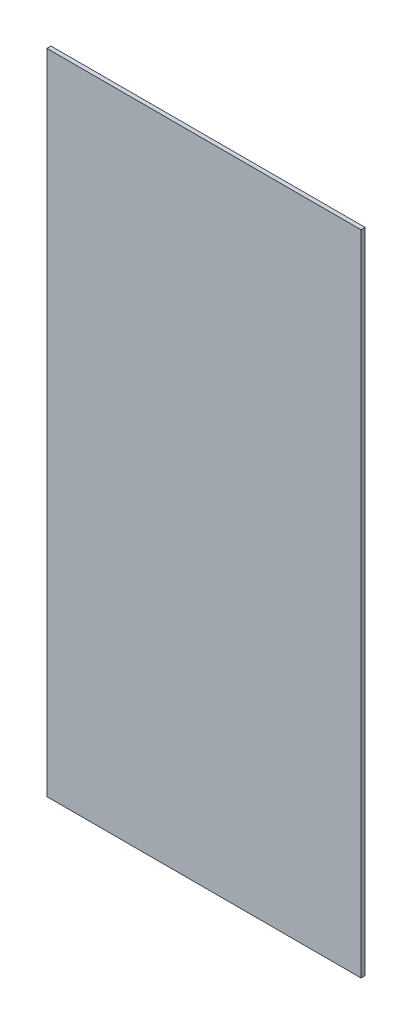
ISO-10303-21;
HEADER;
FILE_DESCRIPTION(('STEP AP214'),'2;1');
FILE_NAME('part.step','',(''),(''),'','','');
FILE_SCHEMA(('AUTOMOTIVE_DESIGN { 1 0 10303 214 1 1 1 1 }'));
ENDSEC;
DATA;
#1=APPLICATION_CONTEXT('core data for automotive mechanical design processes');
#2=APPLICATION_PROTOCOL_DEFINITION('international standard','automotive_design',2000,#1);
#3=PRODUCT_CONTEXT('',#1,'mechanical');
#4=PRODUCT('Part','Part','',(#3));
#5=PRODUCT_RELATED_PRODUCT_CATEGORY('part','',(#4));
#6=PRODUCT_DEFINITION_FORMATION('','',#4);
#7=PRODUCT_DEFINITION_CONTEXT('part definition',#1,'design');
#8=PRODUCT_DEFINITION('design','',#6,#7);
#9=PRODUCT_DEFINITION_SHAPE('','',#8);
#10=(LENGTH_UNIT() NAMED_UNIT(*) SI_UNIT(.MILLI.,.METRE.));
#11=(NAMED_UNIT(*) PLANE_ANGLE_UNIT() SI_UNIT($,.RADIAN.));
#12=(NAMED_UNIT(*) SI_UNIT($,.STERADIAN.) SOLID_ANGLE_UNIT());
#13=UNCERTAINTY_MEASURE_WITH_UNIT(LENGTH_MEASURE(1.E-05),#10,'distance_accuracy_value','');
#14=(GEOMETRIC_REPRESENTATION_CONTEXT(3) GLOBAL_UNCERTAINTY_ASSIGNED_CONTEXT((#13)) GLOBAL_UNIT_ASSIGNED_CONTEXT((#10,
#11,#12)) REPRESENTATION_CONTEXT('',''));
#15=CARTESIAN_POINT('',(0.,0.,0.));
#16=DIRECTION('',(0.,0.,1.));
#17=DIRECTION('',(1.,0.,0.));
#18=AXIS2_PLACEMENT_3D('',#15,#16,#17);
#19=CARTESIAN_POINT('',(0.,0.,15.875));
#20=DIRECTION('',(1.,0.,0.));
#21=DIRECTION('',(0.,0.,-1.));
#22=AXIS2_PLACEMENT_3D('',#19,#20,#21);
#23=PLANE('',#22);
#24=DIRECTION('',(0.,-1.,0.));
#25=VECTOR('',#24,1.);
#26=CARTESIAN_POINT('',(0.,0.,0.));
#27=LINE('',#26,#25);
#28=CARTESIAN_POINT('',(0.,2514.6,0.));
#29=VERTEX_POINT('',#28);
#30=CARTESIAN_POINT('',(0.,0.,0.));
#31=VERTEX_POINT('',#30);
#32=EDGE_CURVE('E95',#29,#31,#27,.T.);
#33=ORIENTED_EDGE('',*,*,#32,.T.);
#34=DIRECTION('',(0.,0.,-1.));
#35=VECTOR('',#34,1.);
#36=CARTESIAN_POINT('',(0.,0.,15.875));
#37=LINE('',#36,#35);
#38=CARTESIAN_POINT('',(0.,0.,15.875));
#39=VERTEX_POINT('',#38);
#40=EDGE_CURVE('E11',#39,#31,#37,.T.);
#41=ORIENTED_EDGE('',*,*,#40,.F.);
#42=DIRECTION('',(0.,-1.,0.));
#43=VECTOR('',#42,1.);
#44=CARTESIAN_POINT('',(0.,0.,15.875));
#45=LINE('',#44,#43);
#46=CARTESIAN_POINT('',(0.,2514.6,15.875));
#47=VERTEX_POINT('',#46);
#48=EDGE_CURVE('E83',#47,#39,#45,.T.);
#49=ORIENTED_EDGE('',*,*,#48,.F.);
#50=DIRECTION('',(0.,0.,-1.));
#51=VECTOR('',#50,1.);
#52=CARTESIAN_POINT('',(0.,2514.6,15.875));
#53=LINE('',#52,#51);
#54=EDGE_CURVE('E91',#47,#29,#53,.T.);
#55=ORIENTED_EDGE('',*,*,#54,.T.);
#56=EDGE_LOOP('',(#33,#41,#49,#55));
#57=FACE_BOUND('',#56,.T.);
#58=ADVANCED_FACE('F32',(#57),#23,.F.);
#59=CARTESIAN_POINT('',(0.,0.,15.875));
#60=DIRECTION('',(0.,1.,0.));
#61=DIRECTION('',(0.,0.,1.));
#62=AXIS2_PLACEMENT_3D('',#59,#60,#61);
#63=PLANE('',#62);
#64=DIRECTION('',(1.,0.,0.));
#65=VECTOR('',#64,1.);
#66=CARTESIAN_POINT('',(0.,0.,0.));
#67=LINE('',#66,#65);
#68=CARTESIAN_POINT('',(1219.2,0.,0.));
#69=VERTEX_POINT('',#68);
#70=EDGE_CURVE('E87',#31,#69,#67,.T.);
#71=ORIENTED_EDGE('',*,*,#70,.T.);
#72=DIRECTION('',(0.,0.,-1.));
#73=VECTOR('',#72,1.);
#74=CARTESIAN_POINT('',(1219.2,0.,15.875));
#75=LINE('',#74,#73);
#76=CARTESIAN_POINT('',(1219.2,0.,15.875));
#77=VERTEX_POINT('',#76);
#78=EDGE_CURVE('E40',#77,#69,#75,.T.);
#79=ORIENTED_EDGE('',*,*,#78,.F.);
#80=DIRECTION('',(1.,0.,0.));
#81=VECTOR('',#80,1.);
#82=CARTESIAN_POINT('',(0.,0.,15.875));
#83=LINE('',#82,#81);
#84=EDGE_CURVE('E78',#39,#77,#83,.T.);
#85=ORIENTED_EDGE('',*,*,#84,.F.);
#86=ORIENTED_EDGE('',*,*,#40,.T.);
#87=EDGE_LOOP('',(#71,#79,#85,#86));
#88=FACE_BOUND('',#87,.T.);
#89=ADVANCED_FACE('F86',(#88),#63,.F.);
#90=CARTESIAN_POINT('',(1219.2,0.,15.875));
#91=DIRECTION('',(-1.,0.,0.));
#92=DIRECTION('',(0.,0.,1.));
#93=AXIS2_PLACEMENT_3D('',#90,#91,#92);
#94=PLANE('',#93);
#95=DIRECTION('',(0.,1.,0.));
#96=VECTOR('',#95,1.);
#97=CARTESIAN_POINT('',(1219.2,0.,0.));
#98=LINE('',#97,#96);
#99=CARTESIAN_POINT('',(1219.2,2514.6,0.));
#100=VERTEX_POINT('',#99);
#101=EDGE_CURVE('E65',#69,#100,#98,.T.);
#102=ORIENTED_EDGE('',*,*,#101,.T.);
#103=DIRECTION('',(0.,0.,-1.));
#104=VECTOR('',#103,1.);
#105=CARTESIAN_POINT('',(1219.2,2514.6,15.875));
#106=LINE('',#105,#104);
#107=CARTESIAN_POINT('',(1219.2,2514.6,15.875));
#108=VERTEX_POINT('',#107);
#109=EDGE_CURVE('E88',#108,#100,#106,.T.);
#110=ORIENTED_EDGE('',*,*,#109,.F.);
#111=DIRECTION('',(0.,1.,0.));
#112=VECTOR('',#111,1.);
#113=CARTESIAN_POINT('',(1219.2,0.,15.875));
#114=LINE('',#113,#112);
#115=EDGE_CURVE('E81',#77,#108,#114,.T.);
#116=ORIENTED_EDGE('',*,*,#115,.F.);
#117=ORIENTED_EDGE('',*,*,#78,.T.);
#118=EDGE_LOOP('',(#102,#110,#116,#117));
#119=FACE_BOUND('',#118,.T.);
#120=ADVANCED_FACE('F89',(#119),#94,.F.);
#121=CARTESIAN_POINT('',(0.,2514.6,15.875));
#122=DIRECTION('',(0.,-1.,0.));
#123=DIRECTION('',(0.,0.,-1.));
#124=AXIS2_PLACEMENT_3D('',#121,#122,#123);
#125=PLANE('',#124);
#126=DIRECTION('',(-1.,0.,0.));
#127=VECTOR('',#126,1.);
#128=CARTESIAN_POINT('',(0.,2514.6,0.));
#129=LINE('',#128,#127);
#130=EDGE_CURVE('E71',#100,#29,#129,.T.);
#131=ORIENTED_EDGE('',*,*,#130,.T.);
#132=ORIENTED_EDGE('',*,*,#54,.F.);
#133=DIRECTION('',(-1.,0.,0.));
#134=VECTOR('',#133,1.);
#135=CARTESIAN_POINT('',(0.,2514.6,15.875));
#136=LINE('',#135,#134);
#137=EDGE_CURVE('E48',#108,#47,#136,.T.);
#138=ORIENTED_EDGE('',*,*,#137,.F.);
#139=ORIENTED_EDGE('',*,*,#109,.T.);
#140=EDGE_LOOP('',(#131,#132,#138,#139));
#141=FACE_BOUND('',#140,.T.);
#142=ADVANCED_FACE('F102',(#141),#125,.F.);
#143=CARTESIAN_POINT('',(0.,0.,15.875));
#144=DIRECTION('',(0.,0.,-1.));
#145=DIRECTION('',(-1.,0.,0.));
#146=AXIS2_PLACEMENT_3D('',#143,#144,#145);
#147=PLANE('',#146);
#148=ORIENTED_EDGE('',*,*,#48,.T.);
#149=ORIENTED_EDGE('',*,*,#84,.T.);
#150=ORIENTED_EDGE('',*,*,#115,.T.);
#151=ORIENTED_EDGE('',*,*,#137,.T.);
#152=EDGE_LOOP('',(#148,#149,#150,#151));
#153=FACE_BOUND('',#152,.T.);
#154=ADVANCED_FACE('F79',(#153),#147,.F.);
#155=CARTESIAN_POINT('',(0.,0.,0.));
#156=DIRECTION('',(0.,0.,-1.));
#157=DIRECTION('',(-1.,0.,0.));
#158=AXIS2_PLACEMENT_3D('',#155,#156,#157);
#159=PLANE('',#158);
#160=ORIENTED_EDGE('',*,*,#32,.F.);
#161=ORIENTED_EDGE('',*,*,#130,.F.);
#162=ORIENTED_EDGE('',*,*,#101,.F.);
#163=ORIENTED_EDGE('',*,*,#70,.F.);
#164=EDGE_LOOP('',(#160,#161,#162,#163));
#165=FACE_BOUND('',#164,.T.);
#166=ADVANCED_FACE('F105',(#165),#159,.T.);
#167=CLOSED_SHELL('',(#58,#89,#120,#142,#154,#166));
#168=MANIFOLD_SOLID_BREP('B2',#167);
#169=ADVANCED_BREP_SHAPE_REPRESENTATION('',(#18,#168),#14);
#170=SHAPE_DEFINITION_REPRESENTATION(#9,#169);
ENDSEC;
END-ISO-10303-21;
